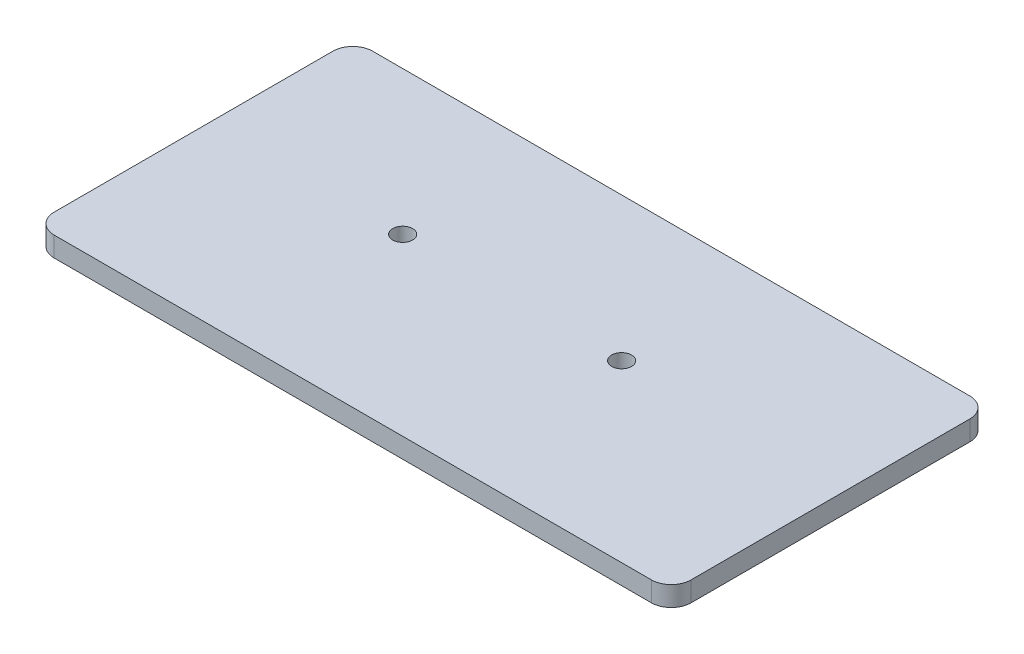
ISO-10303-21;
HEADER;
FILE_DESCRIPTION(('STEP AP214'),'2;1');
FILE_NAME('part.step','',(''),(''),'','','');
FILE_SCHEMA(('AUTOMOTIVE_DESIGN { 1 0 10303 214 1 1 1 1 }'));
ENDSEC;
DATA;
#1=APPLICATION_CONTEXT('core data for automotive mechanical design processes');
#2=APPLICATION_PROTOCOL_DEFINITION('international standard','automotive_design',2000,#1);
#3=PRODUCT_CONTEXT('',#1,'mechanical');
#4=PRODUCT('Part','Part','',(#3));
#5=PRODUCT_RELATED_PRODUCT_CATEGORY('part','',(#4));
#6=PRODUCT_DEFINITION_FORMATION('','',#4);
#7=PRODUCT_DEFINITION_CONTEXT('part definition',#1,'design');
#8=PRODUCT_DEFINITION('design','',#6,#7);
#9=PRODUCT_DEFINITION_SHAPE('','',#8);
#10=(LENGTH_UNIT() NAMED_UNIT(*) SI_UNIT(.MILLI.,.METRE.));
#11=(NAMED_UNIT(*) PLANE_ANGLE_UNIT() SI_UNIT($,.RADIAN.));
#12=(NAMED_UNIT(*) SI_UNIT($,.STERADIAN.) SOLID_ANGLE_UNIT());
#13=UNCERTAINTY_MEASURE_WITH_UNIT(LENGTH_MEASURE(1.E-05),#10,'distance_accuracy_value','');
#14=(GEOMETRIC_REPRESENTATION_CONTEXT(3) GLOBAL_UNCERTAINTY_ASSIGNED_CONTEXT((#13)) GLOBAL_UNIT_ASSIGNED_CONTEXT((#10,
#11,#12)) REPRESENTATION_CONTEXT('',''));
#15=CARTESIAN_POINT('',(0.,0.,0.));
#16=DIRECTION('',(0.,0.,1.));
#17=DIRECTION('',(1.,0.,0.));
#18=AXIS2_PLACEMENT_3D('',#15,#16,#17);
#19=CARTESIAN_POINT('',(0.,6.35,0.));
#20=DIRECTION('',(1.,0.,0.));
#21=DIRECTION('',(0.,0.,-1.));
#22=AXIS2_PLACEMENT_3D('',#19,#20,#21);
#23=PLANE('',#22);
#24=DIRECTION('',(0.,0.,1.));
#25=VECTOR('',#24,1.);
#26=CARTESIAN_POINT('',(0.,6.35,0.));
#27=LINE('',#26,#25);
#28=CARTESIAN_POINT('',(0.,6.35,-95.25));
#29=VERTEX_POINT('',#28);
#30=CARTESIAN_POINT('',(0.,6.35,-6.35));
#31=VERTEX_POINT('',#30);
#32=EDGE_CURVE('E139',#29,#31,#27,.T.);
#33=ORIENTED_EDGE('',*,*,#32,.F.);
#34=DIRECTION('',(0.,-1.,0.));
#35=VECTOR('',#34,1.);
#36=CARTESIAN_POINT('',(0.,6.35,-95.25));
#37=LINE('',#36,#35);
#38=CARTESIAN_POINT('',(0.,0.,-95.25));
#39=VERTEX_POINT('',#38);
#40=EDGE_CURVE('E11',#29,#39,#37,.T.);
#41=ORIENTED_EDGE('',*,*,#40,.T.);
#42=DIRECTION('',(0.,0.,1.));
#43=VECTOR('',#42,1.);
#44=CARTESIAN_POINT('',(0.,0.,0.));
#45=LINE('',#44,#43);
#46=CARTESIAN_POINT('',(0.,0.,-6.35));
#47=VERTEX_POINT('',#46);
#48=EDGE_CURVE('E141',#39,#47,#45,.T.);
#49=ORIENTED_EDGE('',*,*,#48,.T.);
#50=DIRECTION('',(0.,-1.,0.));
#51=VECTOR('',#50,1.);
#52=CARTESIAN_POINT('',(0.,6.35,-6.35));
#53=LINE('',#52,#51);
#54=EDGE_CURVE('E52',#47,#31,#53,.F.);
#55=ORIENTED_EDGE('',*,*,#54,.T.);
#56=EDGE_LOOP('',(#33,#41,#49,#55));
#57=FACE_BOUND('',#56,.T.);
#58=ADVANCED_FACE('F44',(#57),#23,.F.);
#59=CARTESIAN_POINT('',(0.,6.35,0.));
#60=DIRECTION('',(0.,0.,-1.));
#61=DIRECTION('',(-1.,0.,0.));
#62=AXIS2_PLACEMENT_3D('',#59,#60,#61);
#63=PLANE('',#62);
#64=DIRECTION('',(1.,0.,0.));
#65=VECTOR('',#64,1.);
#66=CARTESIAN_POINT('',(0.,0.,0.));
#67=LINE('',#66,#65);
#68=CARTESIAN_POINT('',(6.35,0.,0.));
#69=VERTEX_POINT('',#68);
#70=CARTESIAN_POINT('',(196.85,0.,0.));
#71=VERTEX_POINT('',#70);
#72=EDGE_CURVE('E137',#69,#71,#67,.T.);
#73=ORIENTED_EDGE('',*,*,#72,.T.);
#74=DIRECTION('',(0.,-1.,0.));
#75=VECTOR('',#74,1.);
#76=CARTESIAN_POINT('',(196.85,6.35,0.));
#77=LINE('',#76,#75);
#78=CARTESIAN_POINT('',(196.85,6.35,0.));
#79=VERTEX_POINT('',#78);
#80=EDGE_CURVE('E116',#71,#79,#77,.F.);
#81=ORIENTED_EDGE('',*,*,#80,.T.);
#82=DIRECTION('',(1.,0.,0.));
#83=VECTOR('',#82,1.);
#84=CARTESIAN_POINT('',(0.,6.35,0.));
#85=LINE('',#84,#83);
#86=CARTESIAN_POINT('',(6.35,6.35,0.));
#87=VERTEX_POINT('',#86);
#88=EDGE_CURVE('E177',#87,#79,#85,.T.);
#89=ORIENTED_EDGE('',*,*,#88,.F.);
#90=DIRECTION('',(0.,-1.,0.));
#91=VECTOR('',#90,1.);
#92=CARTESIAN_POINT('',(6.35,6.35,0.));
#93=LINE('',#92,#91);
#94=EDGE_CURVE('E121',#87,#69,#93,.T.);
#95=ORIENTED_EDGE('',*,*,#94,.T.);
#96=EDGE_LOOP('',(#73,#81,#89,#95));
#97=FACE_BOUND('',#96,.T.);
#98=ADVANCED_FACE('F181',(#97),#63,.F.);
#99=CARTESIAN_POINT('',(203.2,6.35,0.));
#100=DIRECTION('',(-1.,0.,0.));
#101=DIRECTION('',(0.,0.,1.));
#102=AXIS2_PLACEMENT_3D('',#99,#100,#101);
#103=PLANE('',#102);
#104=DIRECTION('',(0.,0.,-1.));
#105=VECTOR('',#104,1.);
#106=CARTESIAN_POINT('',(203.2,6.35,0.));
#107=LINE('',#106,#105);
#108=CARTESIAN_POINT('',(203.2,6.35,-6.35));
#109=VERTEX_POINT('',#108);
#110=CARTESIAN_POINT('',(203.2,6.35,-95.25));
#111=VERTEX_POINT('',#110);
#112=EDGE_CURVE('E130',#109,#111,#107,.T.);
#113=ORIENTED_EDGE('',*,*,#112,.F.);
#114=DIRECTION('',(0.,-1.,0.));
#115=VECTOR('',#114,1.);
#116=CARTESIAN_POINT('',(203.2,6.35,-6.35));
#117=LINE('',#116,#115);
#118=CARTESIAN_POINT('',(203.2,0.,-6.35));
#119=VERTEX_POINT('',#118);
#120=EDGE_CURVE('E115',#109,#119,#117,.T.);
#121=ORIENTED_EDGE('',*,*,#120,.T.);
#122=DIRECTION('',(0.,0.,-1.));
#123=VECTOR('',#122,1.);
#124=CARTESIAN_POINT('',(203.2,0.,0.));
#125=LINE('',#124,#123);
#126=CARTESIAN_POINT('',(203.2,0.,-95.25));
#127=VERTEX_POINT('',#126);
#128=EDGE_CURVE('E128',#119,#127,#125,.T.);
#129=ORIENTED_EDGE('',*,*,#128,.T.);
#130=DIRECTION('',(0.,-1.,0.));
#131=VECTOR('',#130,1.);
#132=CARTESIAN_POINT('',(203.2,6.35,-95.25));
#133=LINE('',#132,#131);
#134=EDGE_CURVE('E132',#127,#111,#133,.F.);
#135=ORIENTED_EDGE('',*,*,#134,.T.);
#136=EDGE_LOOP('',(#113,#121,#129,#135));
#137=FACE_BOUND('',#136,.T.);
#138=ADVANCED_FACE('F127',(#137),#103,.F.);
#139=CARTESIAN_POINT('',(0.,6.35,-101.6));
#140=DIRECTION('',(0.,0.,1.));
#141=DIRECTION('',(1.,0.,0.));
#142=AXIS2_PLACEMENT_3D('',#139,#140,#141);
#143=PLANE('',#142);
#144=DIRECTION('',(-1.,0.,0.));
#145=VECTOR('',#144,1.);
#146=CARTESIAN_POINT('',(0.,6.35,-101.6));
#147=LINE('',#146,#145);
#148=CARTESIAN_POINT('',(196.85,6.35,-101.6));
#149=VERTEX_POINT('',#148);
#150=CARTESIAN_POINT('',(6.35,6.35,-101.6));
#151=VERTEX_POINT('',#150);
#152=EDGE_CURVE('E145',#149,#151,#147,.T.);
#153=ORIENTED_EDGE('',*,*,#152,.F.);
#154=DIRECTION('',(0.,-1.,0.));
#155=VECTOR('',#154,1.);
#156=CARTESIAN_POINT('',(196.85,6.35,-101.6));
#157=LINE('',#156,#155);
#158=CARTESIAN_POINT('',(196.85,0.,-101.6));
#159=VERTEX_POINT('',#158);
#160=EDGE_CURVE('E162',#149,#159,#157,.T.);
#161=ORIENTED_EDGE('',*,*,#160,.T.);
#162=DIRECTION('',(-1.,0.,0.));
#163=VECTOR('',#162,1.);
#164=CARTESIAN_POINT('',(0.,0.,-101.6));
#165=LINE('',#164,#163);
#166=CARTESIAN_POINT('',(6.35,0.,-101.6));
#167=VERTEX_POINT('',#166);
#168=EDGE_CURVE('E136',#159,#167,#165,.T.);
#169=ORIENTED_EDGE('',*,*,#168,.T.);
#170=DIRECTION('',(0.,-1.,0.));
#171=VECTOR('',#170,1.);
#172=CARTESIAN_POINT('',(6.35,6.35,-101.6));
#173=LINE('',#172,#171);
#174=EDGE_CURVE('E59',#167,#151,#173,.F.);
#175=ORIENTED_EDGE('',*,*,#174,.T.);
#176=EDGE_LOOP('',(#153,#161,#169,#175));
#177=FACE_BOUND('',#176,.T.);
#178=ADVANCED_FACE('F203',(#177),#143,.F.);
#179=CARTESIAN_POINT('',(0.,6.35,0.));
#180=DIRECTION('',(0.,-1.,0.));
#181=DIRECTION('',(0.,0.,-1.));
#182=AXIS2_PLACEMENT_3D('',#179,#180,#181);
#183=PLANE('',#182);
#184=CARTESIAN_POINT('',(61.7267653828644,6.35,-55.7934705034544));
#185=DIRECTION('',(0.,1.,0.));
#186=DIRECTION('',(0.,0.,1.));
#187=AXIS2_PLACEMENT_3D('',#184,#185,#186);
#188=CIRCLE('',#187,3.17499999999998);
#189=CARTESIAN_POINT('',(61.7267653828644,6.35,-52.6184705034544));
#190=VERTEX_POINT('',#189);
#191=EDGE_CURVE('E195',#190,#190,#188,.T.);
#192=ORIENTED_EDGE('',*,*,#191,.F.);
#193=EDGE_LOOP('',(#192));
#194=FACE_BOUND('',#193,.T.);
#195=CARTESIAN_POINT('',(131.576765382864,6.35,-55.7934705034544));
#196=DIRECTION('',(0.,1.,0.));
#197=DIRECTION('',(0.,0.,1.));
#198=AXIS2_PLACEMENT_3D('',#195,#196,#197);
#199=CIRCLE('',#198,3.17499999999998);
#200=CARTESIAN_POINT('',(131.576765382864,6.35,-52.6184705034544));
#201=VERTEX_POINT('',#200);
#202=EDGE_CURVE('E184',#201,#201,#199,.T.);
#203=ORIENTED_EDGE('',*,*,#202,.F.);
#204=EDGE_LOOP('',(#203));
#205=FACE_BOUND('',#204,.T.);
#206=ORIENTED_EDGE('',*,*,#88,.T.);
#207=CARTESIAN_POINT('',(196.85,6.35,-6.35));
#208=DIRECTION('',(0.,-1.,0.));
#209=DIRECTION('',(0.,0.,-1.));
#210=AXIS2_PLACEMENT_3D('',#207,#208,#209);
#211=CIRCLE('',#210,6.35);
#212=EDGE_CURVE('E159',#79,#109,#211,.F.);
#213=ORIENTED_EDGE('',*,*,#212,.T.);
#214=ORIENTED_EDGE('',*,*,#112,.T.);
#215=CARTESIAN_POINT('',(196.85,6.35,-95.25));
#216=DIRECTION('',(0.,-1.,0.));
#217=DIRECTION('',(0.,0.,-1.));
#218=AXIS2_PLACEMENT_3D('',#215,#216,#217);
#219=CIRCLE('',#218,6.35);
#220=EDGE_CURVE('E66',#111,#149,#219,.F.);
#221=ORIENTED_EDGE('',*,*,#220,.T.);
#222=ORIENTED_EDGE('',*,*,#152,.T.);
#223=CARTESIAN_POINT('',(6.35,6.35,-95.25));
#224=DIRECTION('',(0.,-1.,0.));
#225=DIRECTION('',(0.,0.,-1.));
#226=AXIS2_PLACEMENT_3D('',#223,#224,#225);
#227=CIRCLE('',#226,6.35);
#228=EDGE_CURVE('E156',#151,#29,#227,.F.);
#229=ORIENTED_EDGE('',*,*,#228,.T.);
#230=ORIENTED_EDGE('',*,*,#32,.T.);
#231=CARTESIAN_POINT('',(6.35,6.35,-6.35));
#232=DIRECTION('',(0.,-1.,0.));
#233=DIRECTION('',(0.,0.,-1.));
#234=AXIS2_PLACEMENT_3D('',#231,#232,#233);
#235=CIRCLE('',#234,6.35);
#236=EDGE_CURVE('E154',#31,#87,#235,.F.);
#237=ORIENTED_EDGE('',*,*,#236,.T.);
#238=EDGE_LOOP('',(#206,#213,#214,#221,#222,#229,#230,#237));
#239=FACE_BOUND('',#238,.T.);
#240=ADVANCED_FACE('F174',(#194,#205,#239),#183,.F.);
#241=CARTESIAN_POINT('',(0.,0.,0.));
#242=DIRECTION('',(0.,-1.,0.));
#243=DIRECTION('',(0.,0.,-1.));
#244=AXIS2_PLACEMENT_3D('',#241,#242,#243);
#245=PLANE('',#244);
#246=CARTESIAN_POINT('',(61.7267653828644,0.,-55.7934705034544));
#247=DIRECTION('',(0.,1.,0.));
#248=DIRECTION('',(0.,0.,1.));
#249=AXIS2_PLACEMENT_3D('',#246,#247,#248);
#250=CIRCLE('',#249,3.175);
#251=CARTESIAN_POINT('',(61.7267653828644,0.,-52.6184705034544));
#252=VERTEX_POINT('',#251);
#253=EDGE_CURVE('E192',#252,#252,#250,.T.);
#254=ORIENTED_EDGE('',*,*,#253,.T.);
#255=EDGE_LOOP('',(#254));
#256=FACE_BOUND('',#255,.T.);
#257=CARTESIAN_POINT('',(131.576765382864,0.,-55.7934705034544));
#258=DIRECTION('',(0.,1.,0.));
#259=DIRECTION('',(0.,0.,1.));
#260=AXIS2_PLACEMENT_3D('',#257,#258,#259);
#261=CIRCLE('',#260,3.17500000000001);
#262=CARTESIAN_POINT('',(131.576765382864,0.,-52.6184705034544));
#263=VERTEX_POINT('',#262);
#264=EDGE_CURVE('E182',#263,#263,#261,.T.);
#265=ORIENTED_EDGE('',*,*,#264,.T.);
#266=EDGE_LOOP('',(#265));
#267=FACE_BOUND('',#266,.T.);
#268=ORIENTED_EDGE('',*,*,#128,.F.);
#269=CARTESIAN_POINT('',(196.85,0.,-6.35));
#270=DIRECTION('',(0.,-1.,0.));
#271=DIRECTION('',(0.,0.,-1.));
#272=AXIS2_PLACEMENT_3D('',#269,#270,#271);
#273=CIRCLE('',#272,6.35);
#274=EDGE_CURVE('E111',#119,#71,#273,.T.);
#275=ORIENTED_EDGE('',*,*,#274,.T.);
#276=ORIENTED_EDGE('',*,*,#72,.F.);
#277=CARTESIAN_POINT('',(6.35,0.,-6.35));
#278=DIRECTION('',(0.,-1.,0.));
#279=DIRECTION('',(0.,0.,-1.));
#280=AXIS2_PLACEMENT_3D('',#277,#278,#279);
#281=CIRCLE('',#280,6.35);
#282=EDGE_CURVE('E131',#69,#47,#281,.T.);
#283=ORIENTED_EDGE('',*,*,#282,.T.);
#284=ORIENTED_EDGE('',*,*,#48,.F.);
#285=CARTESIAN_POINT('',(6.35,0.,-95.25));
#286=DIRECTION('',(0.,-1.,0.));
#287=DIRECTION('',(0.,0.,-1.));
#288=AXIS2_PLACEMENT_3D('',#285,#286,#287);
#289=CIRCLE('',#288,6.35);
#290=EDGE_CURVE('E148',#39,#167,#289,.T.);
#291=ORIENTED_EDGE('',*,*,#290,.T.);
#292=ORIENTED_EDGE('',*,*,#168,.F.);
#293=CARTESIAN_POINT('',(196.85,0.,-95.25));
#294=DIRECTION('',(0.,-1.,0.));
#295=DIRECTION('',(0.,0.,-1.));
#296=AXIS2_PLACEMENT_3D('',#293,#294,#295);
#297=CIRCLE('',#296,6.35);
#298=EDGE_CURVE('E122',#159,#127,#297,.T.);
#299=ORIENTED_EDGE('',*,*,#298,.T.);
#300=EDGE_LOOP('',(#268,#275,#276,#283,#284,#291,#292,#299));
#301=FACE_BOUND('',#300,.T.);
#302=ADVANCED_FACE('F134',(#256,#267,#301),#245,.T.);
#303=CARTESIAN_POINT('',(131.576765382864,6.35,-55.7934705034544));
#304=DIRECTION('',(0.,1.,0.));
#305=DIRECTION('',(0.,0.,1.));
#306=AXIS2_PLACEMENT_3D('',#303,#304,#305);
#307=CYLINDRICAL_SURFACE('',#306,3.175);
#308=ORIENTED_EDGE('',*,*,#264,.F.);
#309=EDGE_LOOP('',(#308));
#310=FACE_BOUND('',#309,.T.);
#311=ORIENTED_EDGE('',*,*,#202,.T.);
#312=EDGE_LOOP('',(#311));
#313=FACE_BOUND('',#312,.T.);
#314=ADVANCED_FACE('F207',(#310,#313),#307,.F.);
#315=CARTESIAN_POINT('',(61.7267653828644,6.35,-55.7934705034544));
#316=DIRECTION('',(0.,1.,0.));
#317=DIRECTION('',(0.,0.,1.));
#318=AXIS2_PLACEMENT_3D('',#315,#316,#317);
#319=CYLINDRICAL_SURFACE('',#318,3.17499999999999);
#320=ORIENTED_EDGE('',*,*,#253,.F.);
#321=EDGE_LOOP('',(#320));
#322=FACE_BOUND('',#321,.T.);
#323=ORIENTED_EDGE('',*,*,#191,.T.);
#324=EDGE_LOOP('',(#323));
#325=FACE_BOUND('',#324,.T.);
#326=ADVANCED_FACE('F199',(#322,#325),#319,.F.);
#327=CARTESIAN_POINT('',(196.85,6.35,-6.35));
#328=DIRECTION('',(0.,-1.,0.));
#329=DIRECTION('',(0.,0.,-1.));
#330=AXIS2_PLACEMENT_3D('',#327,#328,#329);
#331=CYLINDRICAL_SURFACE('',#330,6.35);
#332=ORIENTED_EDGE('',*,*,#212,.F.);
#333=ORIENTED_EDGE('',*,*,#80,.F.);
#334=ORIENTED_EDGE('',*,*,#274,.F.);
#335=ORIENTED_EDGE('',*,*,#120,.F.);
#336=EDGE_LOOP('',(#332,#333,#334,#335));
#337=FACE_BOUND('',#336,.T.);
#338=ADVANCED_FACE('F114',(#337),#331,.T.);
#339=CARTESIAN_POINT('',(196.85,6.35,-95.25));
#340=DIRECTION('',(0.,-1.,0.));
#341=DIRECTION('',(0.,0.,-1.));
#342=AXIS2_PLACEMENT_3D('',#339,#340,#341);
#343=CYLINDRICAL_SURFACE('',#342,6.35);
#344=ORIENTED_EDGE('',*,*,#220,.F.);
#345=ORIENTED_EDGE('',*,*,#134,.F.);
#346=ORIENTED_EDGE('',*,*,#298,.F.);
#347=ORIENTED_EDGE('',*,*,#160,.F.);
#348=EDGE_LOOP('',(#344,#345,#346,#347));
#349=FACE_BOUND('',#348,.T.);
#350=ADVANCED_FACE('F230',(#349),#343,.T.);
#351=CARTESIAN_POINT('',(6.35,6.35,-95.25));
#352=DIRECTION('',(0.,-1.,0.));
#353=DIRECTION('',(0.,0.,-1.));
#354=AXIS2_PLACEMENT_3D('',#351,#352,#353);
#355=CYLINDRICAL_SURFACE('',#354,6.35);
#356=ORIENTED_EDGE('',*,*,#228,.F.);
#357=ORIENTED_EDGE('',*,*,#174,.F.);
#358=ORIENTED_EDGE('',*,*,#290,.F.);
#359=ORIENTED_EDGE('',*,*,#40,.F.);
#360=EDGE_LOOP('',(#356,#357,#358,#359));
#361=FACE_BOUND('',#360,.T.);
#362=ADVANCED_FACE('F232',(#361),#355,.T.);
#363=CARTESIAN_POINT('',(6.35,6.35,-6.35));
#364=DIRECTION('',(0.,-1.,0.));
#365=DIRECTION('',(0.,0.,-1.));
#366=AXIS2_PLACEMENT_3D('',#363,#364,#365);
#367=CYLINDRICAL_SURFACE('',#366,6.35);
#368=ORIENTED_EDGE('',*,*,#236,.F.);
#369=ORIENTED_EDGE('',*,*,#54,.F.);
#370=ORIENTED_EDGE('',*,*,#282,.F.);
#371=ORIENTED_EDGE('',*,*,#94,.F.);
#372=EDGE_LOOP('',(#368,#369,#370,#371));
#373=FACE_BOUND('',#372,.T.);
#374=ADVANCED_FACE('F46',(#373),#367,.T.);
#375=CLOSED_SHELL('',(#58,#98,#138,#178,#240,#302,#314,#326,#338,#350,#362,#374));
#376=MANIFOLD_SOLID_BREP('B2',#375);
#377=ADVANCED_BREP_SHAPE_REPRESENTATION('',(#18,#376),#14);
#378=SHAPE_DEFINITION_REPRESENTATION(#9,#377);
ENDSEC;
END-ISO-10303-21;
